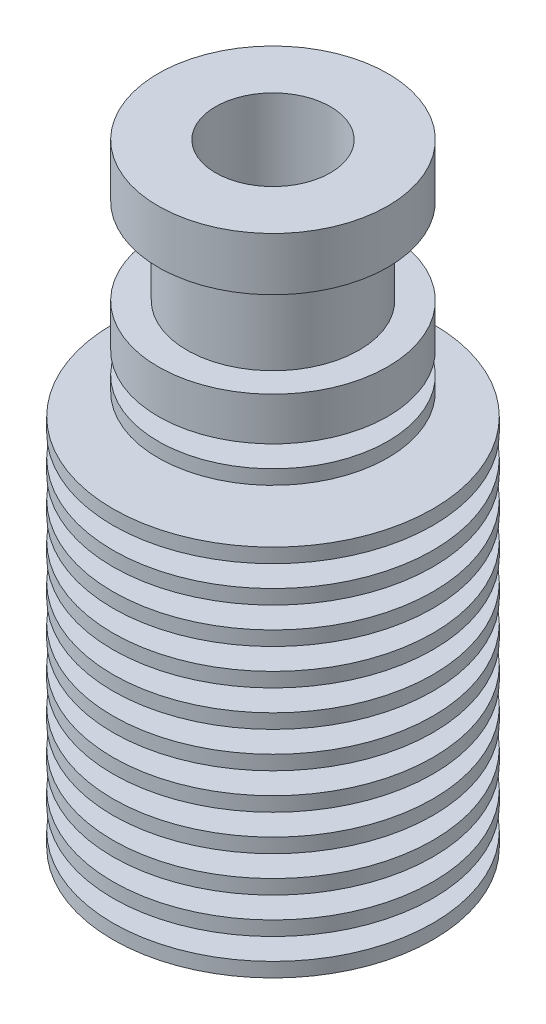
ISO-10303-21;
HEADER;
FILE_DESCRIPTION(('STEP AP214'),'2;1');
FILE_NAME('part.step','',(''),(''),'','','');
FILE_SCHEMA(('AUTOMOTIVE_DESIGN { 1 0 10303 214 1 1 1 1 }'));
ENDSEC;
DATA;
#1=APPLICATION_CONTEXT('core data for automotive mechanical design processes');
#2=APPLICATION_PROTOCOL_DEFINITION('international standard','automotive_design',2000,#1);
#3=PRODUCT_CONTEXT('',#1,'mechanical');
#4=PRODUCT('Part','Part','',(#3));
#5=PRODUCT_RELATED_PRODUCT_CATEGORY('part','',(#4));
#6=PRODUCT_DEFINITION_FORMATION('','',#4);
#7=PRODUCT_DEFINITION_CONTEXT('part definition',#1,'design');
#8=PRODUCT_DEFINITION('design','',#6,#7);
#9=PRODUCT_DEFINITION_SHAPE('','',#8);
#10=(LENGTH_UNIT() NAMED_UNIT(*) SI_UNIT(.MILLI.,.METRE.));
#11=(NAMED_UNIT(*) PLANE_ANGLE_UNIT() SI_UNIT($,.RADIAN.));
#12=(NAMED_UNIT(*) SI_UNIT($,.STERADIAN.) SOLID_ANGLE_UNIT());
#13=UNCERTAINTY_MEASURE_WITH_UNIT(LENGTH_MEASURE(1.E-05),#10,'distance_accuracy_value','');
#14=(GEOMETRIC_REPRESENTATION_CONTEXT(3) GLOBAL_UNCERTAINTY_ASSIGNED_CONTEXT((#13)) GLOBAL_UNIT_ASSIGNED_CONTEXT((#10,
#11,#12)) REPRESENTATION_CONTEXT('',''));
#15=CARTESIAN_POINT('',(0.,0.,0.));
#16=DIRECTION('',(0.,0.,1.));
#17=DIRECTION('',(1.,0.,0.));
#18=AXIS2_PLACEMENT_3D('',#15,#16,#17);
#19=CARTESIAN_POINT('',(0.,21.75,0.));
#20=DIRECTION('',(0.,1.,0.));
#21=DIRECTION('',(1.,0.,0.));
#22=AXIS2_PLACEMENT_3D('',#19,#20,#21);
#23=CYLINDRICAL_SURFACE('',#22,5.22115384615384);
#24=CARTESIAN_POINT('',(0.,21.,0.));
#25=DIRECTION('',(0.,-1.,0.));
#26=DIRECTION('',(1.,0.,0.));
#27=AXIS2_PLACEMENT_3D('',#24,#25,#26);
#28=CIRCLE('',#27,5.22115384615384);
#29=CARTESIAN_POINT('',(5.22115384615384,21.,0.));
#30=VERTEX_POINT('',#29);
#31=EDGE_CURVE('E27',#30,#30,#28,.T.);
#32=ORIENTED_EDGE('',*,*,#31,.F.);
#33=EDGE_LOOP('',(#32));
#34=FACE_BOUND('',#33,.T.);
#35=CARTESIAN_POINT('',(0.,22.5,0.));
#36=DIRECTION('',(0.,-1.,0.));
#37=DIRECTION('',(1.,0.,0.));
#38=AXIS2_PLACEMENT_3D('',#35,#36,#37);
#39=CIRCLE('',#38,5.22115384615384);
#40=CARTESIAN_POINT('',(5.22115384615384,22.5,0.));
#41=VERTEX_POINT('',#40);
#42=EDGE_CURVE('E11',#41,#41,#39,.T.);
#43=ORIENTED_EDGE('',*,*,#42,.T.);
#44=EDGE_LOOP('',(#43));
#45=FACE_BOUND('',#44,.T.);
#46=ADVANCED_FACE('F17',(#34,#45),#23,.T.);
#47=CARTESIAN_POINT('',(11.15,22.5,0.));
#48=DIRECTION('',(0.,1.,0.));
#49=DIRECTION('',(0.707106781186548,0.,0.707106781186548));
#50=AXIS2_PLACEMENT_3D('',#47,#48,#49);
#51=PLANE('',#50);
#52=ORIENTED_EDGE('',*,*,#42,.F.);
#53=EDGE_LOOP('',(#52));
#54=FACE_BOUND('',#53,.T.);
#55=CARTESIAN_POINT('',(0.,22.5,0.));
#56=DIRECTION('',(0.,1.,0.));
#57=DIRECTION('',(1.,0.,0.));
#58=AXIS2_PLACEMENT_3D('',#55,#56,#57);
#59=CIRCLE('',#58,11.15);
#60=CARTESIAN_POINT('',(11.15,22.5,0.));
#61=VERTEX_POINT('',#60);
#62=EDGE_CURVE('E214',#61,#61,#59,.T.);
#63=ORIENTED_EDGE('',*,*,#62,.F.);
#64=EDGE_LOOP('',(#63));
#65=FACE_BOUND('',#64,.T.);
#66=ADVANCED_FACE('F402',(#54,#65),#51,.F.);
#67=CARTESIAN_POINT('',(5.22115384615384,21.,0.));
#68=DIRECTION('',(0.,-1.,0.));
#69=DIRECTION('',(0.707106781186548,0.,0.707106781186548));
#70=AXIS2_PLACEMENT_3D('',#67,#68,#69);
#71=PLANE('',#70);
#72=CARTESIAN_POINT('',(0.,21.,0.));
#73=DIRECTION('',(0.,-1.,0.));
#74=DIRECTION('',(1.,0.,0.));
#75=AXIS2_PLACEMENT_3D('',#72,#73,#74);
#76=CIRCLE('',#75,11.15);
#77=CARTESIAN_POINT('',(11.15,21.,0.));
#78=VERTEX_POINT('',#77);
#79=EDGE_CURVE('E225',#78,#78,#76,.T.);
#80=ORIENTED_EDGE('',*,*,#79,.F.);
#81=EDGE_LOOP('',(#80));
#82=FACE_BOUND('',#81,.T.);
#83=ORIENTED_EDGE('',*,*,#31,.T.);
#84=EDGE_LOOP('',(#83));
#85=FACE_BOUND('',#84,.T.);
#86=ADVANCED_FACE('F407',(#82,#85),#71,.F.);
#87=CARTESIAN_POINT('',(0.,16.75,0.));
#88=DIRECTION('',(0.,1.,0.));
#89=DIRECTION('',(1.,0.,0.));
#90=AXIS2_PLACEMENT_3D('',#87,#88,#89);
#91=CYLINDRICAL_SURFACE('',#90,5.44230769230769);
#92=CARTESIAN_POINT('',(0.,16.,0.));
#93=DIRECTION('',(0.,-1.,0.));
#94=DIRECTION('',(1.,0.,0.));
#95=AXIS2_PLACEMENT_3D('',#92,#93,#94);
#96=CIRCLE('',#95,5.44230769230769);
#97=CARTESIAN_POINT('',(5.44230769230769,16.,0.));
#98=VERTEX_POINT('',#97);
#99=EDGE_CURVE('E230',#98,#98,#96,.T.);
#100=ORIENTED_EDGE('',*,*,#99,.F.);
#101=EDGE_LOOP('',(#100));
#102=FACE_BOUND('',#101,.T.);
#103=CARTESIAN_POINT('',(0.,17.5,0.));
#104=DIRECTION('',(0.,-1.,0.));
#105=DIRECTION('',(1.,0.,0.));
#106=AXIS2_PLACEMENT_3D('',#103,#104,#105);
#107=CIRCLE('',#106,5.44230769230769);
#108=CARTESIAN_POINT('',(5.44230769230769,17.5,0.));
#109=VERTEX_POINT('',#108);
#110=EDGE_CURVE('E233',#109,#109,#107,.T.);
#111=ORIENTED_EDGE('',*,*,#110,.T.);
#112=EDGE_LOOP('',(#111));
#113=FACE_BOUND('',#112,.T.);
#114=ADVANCED_FACE('F414',(#102,#113),#91,.T.);
#115=CARTESIAN_POINT('',(11.15,17.5,0.));
#116=DIRECTION('',(0.,1.,0.));
#117=DIRECTION('',(0.707106781186548,0.,0.707106781186548));
#118=AXIS2_PLACEMENT_3D('',#115,#116,#117);
#119=PLANE('',#118);
#120=ORIENTED_EDGE('',*,*,#110,.F.);
#121=EDGE_LOOP('',(#120));
#122=FACE_BOUND('',#121,.T.);
#123=CARTESIAN_POINT('',(0.,17.5,0.));
#124=DIRECTION('',(0.,1.,0.));
#125=DIRECTION('',(1.,0.,0.));
#126=AXIS2_PLACEMENT_3D('',#123,#124,#125);
#127=CIRCLE('',#126,11.15);
#128=CARTESIAN_POINT('',(11.15,17.5,0.));
#129=VERTEX_POINT('',#128);
#130=EDGE_CURVE('E237',#129,#129,#127,.T.);
#131=ORIENTED_EDGE('',*,*,#130,.F.);
#132=EDGE_LOOP('',(#131));
#133=FACE_BOUND('',#132,.T.);
#134=ADVANCED_FACE('F418',(#122,#133),#119,.F.);
#135=CARTESIAN_POINT('',(5.44230769230769,16.,0.));
#136=DIRECTION('',(0.,-1.,0.));
#137=DIRECTION('',(0.707106781186548,0.,0.707106781186548));
#138=AXIS2_PLACEMENT_3D('',#135,#136,#137);
#139=PLANE('',#138);
#140=CARTESIAN_POINT('',(0.,16.,0.));
#141=DIRECTION('',(0.,-1.,0.));
#142=DIRECTION('',(1.,0.,0.));
#143=AXIS2_PLACEMENT_3D('',#140,#141,#142);
#144=CIRCLE('',#143,11.15);
#145=CARTESIAN_POINT('',(11.15,16.,0.));
#146=VERTEX_POINT('',#145);
#147=EDGE_CURVE('E242',#146,#146,#144,.T.);
#148=ORIENTED_EDGE('',*,*,#147,.F.);
#149=EDGE_LOOP('',(#148));
#150=FACE_BOUND('',#149,.T.);
#151=ORIENTED_EDGE('',*,*,#99,.T.);
#152=EDGE_LOOP('',(#151));
#153=FACE_BOUND('',#152,.T.);
#154=ADVANCED_FACE('F422',(#150,#153),#139,.F.);
#155=CARTESIAN_POINT('',(0.,11.75,0.));
#156=DIRECTION('',(0.,1.,0.));
#157=DIRECTION('',(1.,0.,0.));
#158=AXIS2_PLACEMENT_3D('',#155,#156,#157);
#159=CYLINDRICAL_SURFACE('',#158,5.66346153846154);
#160=CARTESIAN_POINT('',(0.,11.,0.));
#161=DIRECTION('',(0.,-1.,0.));
#162=DIRECTION('',(1.,0.,0.));
#163=AXIS2_PLACEMENT_3D('',#160,#161,#162);
#164=CIRCLE('',#163,5.66346153846154);
#165=CARTESIAN_POINT('',(5.66346153846154,11.,0.));
#166=VERTEX_POINT('',#165);
#167=EDGE_CURVE('E247',#166,#166,#164,.T.);
#168=ORIENTED_EDGE('',*,*,#167,.F.);
#169=EDGE_LOOP('',(#168));
#170=FACE_BOUND('',#169,.T.);
#171=CARTESIAN_POINT('',(0.,12.5,0.));
#172=DIRECTION('',(0.,-1.,0.));
#173=DIRECTION('',(1.,0.,0.));
#174=AXIS2_PLACEMENT_3D('',#171,#172,#173);
#175=CIRCLE('',#174,5.66346153846154);
#176=CARTESIAN_POINT('',(5.66346153846154,12.5,0.));
#177=VERTEX_POINT('',#176);
#178=EDGE_CURVE('E234',#177,#177,#175,.T.);
#179=ORIENTED_EDGE('',*,*,#178,.T.);
#180=EDGE_LOOP('',(#179));
#181=FACE_BOUND('',#180,.T.);
#182=ADVANCED_FACE('F426',(#170,#181),#159,.T.);
#183=CARTESIAN_POINT('',(11.15,12.5,0.));
#184=DIRECTION('',(0.,1.,0.));
#185=DIRECTION('',(0.707106781186548,0.,0.707106781186548));
#186=AXIS2_PLACEMENT_3D('',#183,#184,#185);
#187=PLANE('',#186);
#188=ORIENTED_EDGE('',*,*,#178,.F.);
#189=EDGE_LOOP('',(#188));
#190=FACE_BOUND('',#189,.T.);
#191=CARTESIAN_POINT('',(0.,12.5,0.));
#192=DIRECTION('',(0.,1.,0.));
#193=DIRECTION('',(1.,0.,0.));
#194=AXIS2_PLACEMENT_3D('',#191,#192,#193);
#195=CIRCLE('',#194,11.15);
#196=CARTESIAN_POINT('',(11.15,12.5,0.));
#197=VERTEX_POINT('',#196);
#198=EDGE_CURVE('E253',#197,#197,#195,.T.);
#199=ORIENTED_EDGE('',*,*,#198,.F.);
#200=EDGE_LOOP('',(#199));
#201=FACE_BOUND('',#200,.T.);
#202=ADVANCED_FACE('F430',(#190,#201),#187,.F.);
#203=CARTESIAN_POINT('',(5.66346153846154,11.,0.));
#204=DIRECTION('',(0.,-1.,0.));
#205=DIRECTION('',(0.707106781186548,0.,0.707106781186548));
#206=AXIS2_PLACEMENT_3D('',#203,#204,#205);
#207=PLANE('',#206);
#208=CARTESIAN_POINT('',(0.,11.,0.));
#209=DIRECTION('',(0.,-1.,0.));
#210=DIRECTION('',(1.,0.,0.));
#211=AXIS2_PLACEMENT_3D('',#208,#209,#210);
#212=CIRCLE('',#211,11.15);
#213=CARTESIAN_POINT('',(11.15,11.,0.));
#214=VERTEX_POINT('',#213);
#215=EDGE_CURVE('E258',#214,#214,#212,.T.);
#216=ORIENTED_EDGE('',*,*,#215,.F.);
#217=EDGE_LOOP('',(#216));
#218=FACE_BOUND('',#217,.T.);
#219=ORIENTED_EDGE('',*,*,#167,.T.);
#220=EDGE_LOOP('',(#219));
#221=FACE_BOUND('',#220,.T.);
#222=ADVANCED_FACE('F434',(#218,#221),#207,.F.);
#223=CARTESIAN_POINT('',(5.88461538461538,6.,0.));
#224=DIRECTION('',(0.,-1.,0.));
#225=DIRECTION('',(0.707106781186548,0.,0.707106781186548));
#226=AXIS2_PLACEMENT_3D('',#223,#224,#225);
#227=PLANE('',#226);
#228=CARTESIAN_POINT('',(0.,6.,0.));
#229=DIRECTION('',(0.,-1.,0.));
#230=DIRECTION('',(1.,0.,0.));
#231=AXIS2_PLACEMENT_3D('',#228,#229,#230);
#232=CIRCLE('',#231,11.15);
#233=CARTESIAN_POINT('',(11.15,6.,0.));
#234=VERTEX_POINT('',#233);
#235=EDGE_CURVE('E262',#234,#234,#232,.T.);
#236=ORIENTED_EDGE('',*,*,#235,.F.);
#237=EDGE_LOOP('',(#236));
#238=FACE_BOUND('',#237,.T.);
#239=CARTESIAN_POINT('',(0.,6.,0.));
#240=DIRECTION('',(0.,-1.,0.));
#241=DIRECTION('',(1.,0.,0.));
#242=AXIS2_PLACEMENT_3D('',#239,#240,#241);
#243=CIRCLE('',#242,5.88461538461538);
#244=CARTESIAN_POINT('',(5.88461538461538,6.,0.));
#245=VERTEX_POINT('',#244);
#246=EDGE_CURVE('E250',#245,#245,#243,.T.);
#247=ORIENTED_EDGE('',*,*,#246,.T.);
#248=EDGE_LOOP('',(#247));
#249=FACE_BOUND('',#248,.T.);
#250=ADVANCED_FACE('F438',(#238,#249),#227,.F.);
#251=CARTESIAN_POINT('',(0.,6.75,0.));
#252=DIRECTION('',(0.,1.,0.));
#253=DIRECTION('',(1.,0.,0.));
#254=AXIS2_PLACEMENT_3D('',#251,#252,#253);
#255=CYLINDRICAL_SURFACE('',#254,5.88461538461538);
#256=ORIENTED_EDGE('',*,*,#246,.F.);
#257=EDGE_LOOP('',(#256));
#258=FACE_BOUND('',#257,.T.);
#259=CARTESIAN_POINT('',(0.,7.5,0.));
#260=DIRECTION('',(0.,-1.,0.));
#261=DIRECTION('',(1.,0.,0.));
#262=AXIS2_PLACEMENT_3D('',#259,#260,#261);
#263=CIRCLE('',#262,5.88461538461538);
#264=CARTESIAN_POINT('',(5.88461538461538,7.5,0.));
#265=VERTEX_POINT('',#264);
#266=EDGE_CURVE('E269',#265,#265,#263,.T.);
#267=ORIENTED_EDGE('',*,*,#266,.T.);
#268=EDGE_LOOP('',(#267));
#269=FACE_BOUND('',#268,.T.);
#270=ADVANCED_FACE('F442',(#258,#269),#255,.T.);
#271=CARTESIAN_POINT('',(11.15,7.5,0.));
#272=DIRECTION('',(0.,1.,0.));
#273=DIRECTION('',(0.707106781186548,0.,0.707106781186548));
#274=AXIS2_PLACEMENT_3D('',#271,#272,#273);
#275=PLANE('',#274);
#276=ORIENTED_EDGE('',*,*,#266,.F.);
#277=EDGE_LOOP('',(#276));
#278=FACE_BOUND('',#277,.T.);
#279=CARTESIAN_POINT('',(0.,7.5,0.));
#280=DIRECTION('',(0.,1.,0.));
#281=DIRECTION('',(1.,0.,0.));
#282=AXIS2_PLACEMENT_3D('',#279,#280,#281);
#283=CIRCLE('',#282,11.15);
#284=CARTESIAN_POINT('',(11.15,7.5,0.));
#285=VERTEX_POINT('',#284);
#286=EDGE_CURVE('E273',#285,#285,#283,.T.);
#287=ORIENTED_EDGE('',*,*,#286,.F.);
#288=EDGE_LOOP('',(#287));
#289=FACE_BOUND('',#288,.T.);
#290=ADVANCED_FACE('F446',(#278,#289),#275,.F.);
#291=CARTESIAN_POINT('',(6.10576923076923,1.,0.));
#292=DIRECTION('',(0.,-1.,0.));
#293=DIRECTION('',(0.707106781186548,0.,0.707106781186548));
#294=AXIS2_PLACEMENT_3D('',#291,#292,#293);
#295=PLANE('',#294);
#296=CARTESIAN_POINT('',(0.,1.,0.));
#297=DIRECTION('',(0.,-1.,0.));
#298=DIRECTION('',(1.,0.,0.));
#299=AXIS2_PLACEMENT_3D('',#296,#297,#298);
#300=CIRCLE('',#299,11.15);
#301=CARTESIAN_POINT('',(11.15,1.,0.));
#302=VERTEX_POINT('',#301);
#303=EDGE_CURVE('E256',#302,#302,#300,.T.);
#304=ORIENTED_EDGE('',*,*,#303,.F.);
#305=EDGE_LOOP('',(#304));
#306=FACE_BOUND('',#305,.T.);
#307=CARTESIAN_POINT('',(0.,1.,0.));
#308=DIRECTION('',(0.,-1.,0.));
#309=DIRECTION('',(1.,0.,0.));
#310=AXIS2_PLACEMENT_3D('',#307,#308,#309);
#311=CIRCLE('',#310,6.10576923076923);
#312=CARTESIAN_POINT('',(6.10576923076923,1.,0.));
#313=VERTEX_POINT('',#312);
#314=EDGE_CURVE('E272',#313,#313,#311,.T.);
#315=ORIENTED_EDGE('',*,*,#314,.T.);
#316=EDGE_LOOP('',(#315));
#317=FACE_BOUND('',#316,.T.);
#318=ADVANCED_FACE('F450',(#306,#317),#295,.F.);
#319=CARTESIAN_POINT('',(0.,1.75,0.));
#320=DIRECTION('',(0.,1.,0.));
#321=DIRECTION('',(1.,0.,0.));
#322=AXIS2_PLACEMENT_3D('',#319,#320,#321);
#323=CYLINDRICAL_SURFACE('',#322,6.10576923076923);
#324=ORIENTED_EDGE('',*,*,#314,.F.);
#325=EDGE_LOOP('',(#324));
#326=FACE_BOUND('',#325,.T.);
#327=CARTESIAN_POINT('',(0.,2.5,0.));
#328=DIRECTION('',(0.,-1.,0.));
#329=DIRECTION('',(1.,0.,0.));
#330=AXIS2_PLACEMENT_3D('',#327,#328,#329);
#331=CIRCLE('',#330,6.10576923076923);
#332=CARTESIAN_POINT('',(6.10576923076923,2.5,0.));
#333=VERTEX_POINT('',#332);
#334=EDGE_CURVE('E281',#333,#333,#331,.T.);
#335=ORIENTED_EDGE('',*,*,#334,.T.);
#336=EDGE_LOOP('',(#335));
#337=FACE_BOUND('',#336,.T.);
#338=ADVANCED_FACE('F454',(#326,#337),#323,.T.);
#339=CARTESIAN_POINT('',(11.15,2.5,0.));
#340=DIRECTION('',(0.,1.,0.));
#341=DIRECTION('',(0.707106781186548,0.,0.707106781186548));
#342=AXIS2_PLACEMENT_3D('',#339,#340,#341);
#343=PLANE('',#342);
#344=ORIENTED_EDGE('',*,*,#334,.F.);
#345=EDGE_LOOP('',(#344));
#346=FACE_BOUND('',#345,.T.);
#347=CARTESIAN_POINT('',(0.,2.5,0.));
#348=DIRECTION('',(0.,1.,0.));
#349=DIRECTION('',(1.,0.,0.));
#350=AXIS2_PLACEMENT_3D('',#347,#348,#349);
#351=CIRCLE('',#350,11.15);
#352=CARTESIAN_POINT('',(11.15,2.5,0.));
#353=VERTEX_POINT('',#352);
#354=EDGE_CURVE('E265',#353,#353,#351,.T.);
#355=ORIENTED_EDGE('',*,*,#354,.F.);
#356=EDGE_LOOP('',(#355));
#357=FACE_BOUND('',#356,.T.);
#358=ADVANCED_FACE('F458',(#346,#357),#343,.F.);
#359=CARTESIAN_POINT('',(0.,4.25,0.));
#360=DIRECTION('',(0.,1.,0.));
#361=DIRECTION('',(1.,0.,0.));
#362=AXIS2_PLACEMENT_3D('',#359,#360,#361);
#363=CYLINDRICAL_SURFACE('',#362,5.9951923076923);
#364=CARTESIAN_POINT('',(0.,3.5,0.));
#365=DIRECTION('',(0.,-1.,0.));
#366=DIRECTION('',(1.,0.,0.));
#367=AXIS2_PLACEMENT_3D('',#364,#365,#366);
#368=CIRCLE('',#367,5.99519230769231);
#369=CARTESIAN_POINT('',(5.99519230769231,3.5,0.));
#370=VERTEX_POINT('',#369);
#371=EDGE_CURVE('E287',#370,#370,#368,.T.);
#372=ORIENTED_EDGE('',*,*,#371,.F.);
#373=EDGE_LOOP('',(#372));
#374=FACE_BOUND('',#373,.T.);
#375=CARTESIAN_POINT('',(0.,5.,0.));
#376=DIRECTION('',(0.,-1.,0.));
#377=DIRECTION('',(1.,0.,0.));
#378=AXIS2_PLACEMENT_3D('',#375,#376,#377);
#379=CIRCLE('',#378,5.9951923076923);
#380=CARTESIAN_POINT('',(5.9951923076923,5.,0.));
#381=VERTEX_POINT('',#380);
#382=EDGE_CURVE('E284',#381,#381,#379,.T.);
#383=ORIENTED_EDGE('',*,*,#382,.T.);
#384=EDGE_LOOP('',(#383));
#385=FACE_BOUND('',#384,.T.);
#386=ADVANCED_FACE('F462',(#374,#385),#363,.T.);
#387=CARTESIAN_POINT('',(11.15,5.,0.));
#388=DIRECTION('',(0.,1.,0.));
#389=DIRECTION('',(0.707106781186548,0.,0.707106781186548));
#390=AXIS2_PLACEMENT_3D('',#387,#388,#389);
#391=PLANE('',#390);
#392=ORIENTED_EDGE('',*,*,#382,.F.);
#393=EDGE_LOOP('',(#392));
#394=FACE_BOUND('',#393,.T.);
#395=CARTESIAN_POINT('',(0.,5.,0.));
#396=DIRECTION('',(0.,1.,0.));
#397=DIRECTION('',(1.,0.,0.));
#398=AXIS2_PLACEMENT_3D('',#395,#396,#397);
#399=CIRCLE('',#398,11.15);
#400=CARTESIAN_POINT('',(11.15,5.,0.));
#401=VERTEX_POINT('',#400);
#402=EDGE_CURVE('E266',#401,#401,#399,.T.);
#403=ORIENTED_EDGE('',*,*,#402,.F.);
#404=EDGE_LOOP('',(#403));
#405=FACE_BOUND('',#404,.T.);
#406=ADVANCED_FACE('F466',(#394,#405),#391,.F.);
#407=CARTESIAN_POINT('',(5.99519230769231,3.5,0.));
#408=DIRECTION('',(0.,-1.,0.));
#409=DIRECTION('',(0.707106781186548,0.,0.707106781186548));
#410=AXIS2_PLACEMENT_3D('',#407,#408,#409);
#411=PLANE('',#410);
#412=CARTESIAN_POINT('',(0.,3.5,0.));
#413=DIRECTION('',(0.,-1.,0.));
#414=DIRECTION('',(1.,0.,0.));
#415=AXIS2_PLACEMENT_3D('',#412,#413,#414);
#416=CIRCLE('',#415,11.15);
#417=CARTESIAN_POINT('',(11.15,3.5,0.));
#418=VERTEX_POINT('',#417);
#419=EDGE_CURVE('E261',#418,#418,#416,.T.);
#420=ORIENTED_EDGE('',*,*,#419,.F.);
#421=EDGE_LOOP('',(#420));
#422=FACE_BOUND('',#421,.T.);
#423=ORIENTED_EDGE('',*,*,#371,.T.);
#424=EDGE_LOOP('',(#423));
#425=FACE_BOUND('',#424,.T.);
#426=ADVANCED_FACE('F470',(#422,#425),#411,.F.);
#427=CARTESIAN_POINT('',(5.77403846153846,8.5,0.));
#428=DIRECTION('',(0.,-1.,0.));
#429=DIRECTION('',(0.707106781186548,0.,0.707106781186548));
#430=AXIS2_PLACEMENT_3D('',#427,#428,#429);
#431=PLANE('',#430);
#432=CARTESIAN_POINT('',(0.,8.5,0.));
#433=DIRECTION('',(0.,-1.,0.));
#434=DIRECTION('',(1.,0.,0.));
#435=AXIS2_PLACEMENT_3D('',#432,#433,#434);
#436=CIRCLE('',#435,11.15);
#437=CARTESIAN_POINT('',(11.15,8.5,0.));
#438=VERTEX_POINT('',#437);
#439=EDGE_CURVE('E276',#438,#438,#436,.T.);
#440=ORIENTED_EDGE('',*,*,#439,.F.);
#441=EDGE_LOOP('',(#440));
#442=FACE_BOUND('',#441,.T.);
#443=CARTESIAN_POINT('',(0.,8.5,0.));
#444=DIRECTION('',(0.,-1.,0.));
#445=DIRECTION('',(1.,0.,0.));
#446=AXIS2_PLACEMENT_3D('',#443,#444,#445);
#447=CIRCLE('',#446,5.77403846153846);
#448=CARTESIAN_POINT('',(5.77403846153846,8.5,0.));
#449=VERTEX_POINT('',#448);
#450=EDGE_CURVE('E290',#449,#449,#447,.T.);
#451=ORIENTED_EDGE('',*,*,#450,.T.);
#452=EDGE_LOOP('',(#451));
#453=FACE_BOUND('',#452,.T.);
#454=ADVANCED_FACE('F474',(#442,#453),#431,.F.);
#455=CARTESIAN_POINT('',(0.,9.25,0.));
#456=DIRECTION('',(0.,1.,0.));
#457=DIRECTION('',(1.,0.,0.));
#458=AXIS2_PLACEMENT_3D('',#455,#456,#457);
#459=CYLINDRICAL_SURFACE('',#458,5.77403846153846);
#460=ORIENTED_EDGE('',*,*,#450,.F.);
#461=EDGE_LOOP('',(#460));
#462=FACE_BOUND('',#461,.T.);
#463=CARTESIAN_POINT('',(0.,10.,0.));
#464=DIRECTION('',(0.,-1.,0.));
#465=DIRECTION('',(1.,0.,0.));
#466=AXIS2_PLACEMENT_3D('',#463,#464,#465);
#467=CIRCLE('',#466,5.77403846153846);
#468=CARTESIAN_POINT('',(5.77403846153846,10.,0.));
#469=VERTEX_POINT('',#468);
#470=EDGE_CURVE('E301',#469,#469,#467,.T.);
#471=ORIENTED_EDGE('',*,*,#470,.T.);
#472=EDGE_LOOP('',(#471));
#473=FACE_BOUND('',#472,.T.);
#474=ADVANCED_FACE('F478',(#462,#473),#459,.T.);
#475=CARTESIAN_POINT('',(11.15,10.,0.));
#476=DIRECTION('',(0.,1.,0.));
#477=DIRECTION('',(0.707106781186548,0.,0.707106781186548));
#478=AXIS2_PLACEMENT_3D('',#475,#476,#477);
#479=PLANE('',#478);
#480=ORIENTED_EDGE('',*,*,#470,.F.);
#481=EDGE_LOOP('',(#480));
#482=FACE_BOUND('',#481,.T.);
#483=CARTESIAN_POINT('',(0.,10.,0.));
#484=DIRECTION('',(0.,1.,0.));
#485=DIRECTION('',(1.,0.,0.));
#486=AXIS2_PLACEMENT_3D('',#483,#484,#485);
#487=CIRCLE('',#486,11.15);
#488=CARTESIAN_POINT('',(11.15,10.,0.));
#489=VERTEX_POINT('',#488);
#490=EDGE_CURVE('E246',#489,#489,#487,.T.);
#491=ORIENTED_EDGE('',*,*,#490,.F.);
#492=EDGE_LOOP('',(#491));
#493=FACE_BOUND('',#492,.T.);
#494=ADVANCED_FACE('F482',(#482,#493),#479,.F.);
#495=CARTESIAN_POINT('',(5.55288461538461,13.5,0.));
#496=DIRECTION('',(0.,-1.,0.));
#497=DIRECTION('',(0.707106781186548,0.,0.707106781186548));
#498=AXIS2_PLACEMENT_3D('',#495,#496,#497);
#499=PLANE('',#498);
#500=CARTESIAN_POINT('',(0.,13.5,0.));
#501=DIRECTION('',(0.,-1.,0.));
#502=DIRECTION('',(1.,0.,0.));
#503=AXIS2_PLACEMENT_3D('',#500,#501,#502);
#504=CIRCLE('',#503,11.15);
#505=CARTESIAN_POINT('',(11.15,13.5,0.));
#506=VERTEX_POINT('',#505);
#507=EDGE_CURVE('E257',#506,#506,#504,.T.);
#508=ORIENTED_EDGE('',*,*,#507,.F.);
#509=EDGE_LOOP('',(#508));
#510=FACE_BOUND('',#509,.T.);
#511=CARTESIAN_POINT('',(0.,13.5,0.));
#512=DIRECTION('',(0.,-1.,0.));
#513=DIRECTION('',(1.,0.,0.));
#514=AXIS2_PLACEMENT_3D('',#511,#512,#513);
#515=CIRCLE('',#514,5.55288461538461);
#516=CARTESIAN_POINT('',(5.55288461538461,13.5,0.));
#517=VERTEX_POINT('',#516);
#518=EDGE_CURVE('E304',#517,#517,#515,.T.);
#519=ORIENTED_EDGE('',*,*,#518,.T.);
#520=EDGE_LOOP('',(#519));
#521=FACE_BOUND('',#520,.T.);
#522=ADVANCED_FACE('F486',(#510,#521),#499,.F.);
#523=CARTESIAN_POINT('',(0.,14.25,0.));
#524=DIRECTION('',(0.,1.,0.));
#525=DIRECTION('',(1.,0.,0.));
#526=AXIS2_PLACEMENT_3D('',#523,#524,#525);
#527=CYLINDRICAL_SURFACE('',#526,5.55288461538461);
#528=ORIENTED_EDGE('',*,*,#518,.F.);
#529=EDGE_LOOP('',(#528));
#530=FACE_BOUND('',#529,.T.);
#531=CARTESIAN_POINT('',(0.,15.,0.));
#532=DIRECTION('',(0.,-1.,0.));
#533=DIRECTION('',(1.,0.,0.));
#534=AXIS2_PLACEMENT_3D('',#531,#532,#533);
#535=CIRCLE('',#534,5.55288461538461);
#536=CARTESIAN_POINT('',(5.55288461538461,15.,0.));
#537=VERTEX_POINT('',#536);
#538=EDGE_CURVE('E311',#537,#537,#535,.T.);
#539=ORIENTED_EDGE('',*,*,#538,.T.);
#540=EDGE_LOOP('',(#539));
#541=FACE_BOUND('',#540,.T.);
#542=ADVANCED_FACE('F490',(#530,#541),#527,.T.);
#543=CARTESIAN_POINT('',(11.15,15.,0.));
#544=DIRECTION('',(0.,1.,0.));
#545=DIRECTION('',(0.707106781186548,0.,0.707106781186548));
#546=AXIS2_PLACEMENT_3D('',#543,#544,#545);
#547=PLANE('',#546);
#548=ORIENTED_EDGE('',*,*,#538,.F.);
#549=EDGE_LOOP('',(#548));
#550=FACE_BOUND('',#549,.T.);
#551=CARTESIAN_POINT('',(0.,15.,0.));
#552=DIRECTION('',(0.,1.,0.));
#553=DIRECTION('',(1.,0.,0.));
#554=AXIS2_PLACEMENT_3D('',#551,#552,#553);
#555=CIRCLE('',#554,11.15);
#556=CARTESIAN_POINT('',(11.15,15.,0.));
#557=VERTEX_POINT('',#556);
#558=EDGE_CURVE('E245',#557,#557,#555,.T.);
#559=ORIENTED_EDGE('',*,*,#558,.F.);
#560=EDGE_LOOP('',(#559));
#561=FACE_BOUND('',#560,.T.);
#562=ADVANCED_FACE('F494',(#550,#561),#547,.F.);
#563=CARTESIAN_POINT('',(5.33173076923077,18.5,0.));
#564=DIRECTION('',(0.,-1.,0.));
#565=DIRECTION('',(0.707106781186548,0.,0.707106781186548));
#566=AXIS2_PLACEMENT_3D('',#563,#564,#565);
#567=PLANE('',#566);
#568=CARTESIAN_POINT('',(0.,18.5,0.));
#569=DIRECTION('',(0.,-1.,0.));
#570=DIRECTION('',(1.,0.,0.));
#571=AXIS2_PLACEMENT_3D('',#568,#569,#570);
#572=CIRCLE('',#571,11.15);
#573=CARTESIAN_POINT('',(11.15,18.5,0.));
#574=VERTEX_POINT('',#573);
#575=EDGE_CURVE('E240',#574,#574,#572,.T.);
#576=ORIENTED_EDGE('',*,*,#575,.F.);
#577=EDGE_LOOP('',(#576));
#578=FACE_BOUND('',#577,.T.);
#579=CARTESIAN_POINT('',(0.,18.5,0.));
#580=DIRECTION('',(0.,-1.,0.));
#581=DIRECTION('',(1.,0.,0.));
#582=AXIS2_PLACEMENT_3D('',#579,#580,#581);
#583=CIRCLE('',#582,5.33173076923077);
#584=CARTESIAN_POINT('',(5.33173076923077,18.5,0.));
#585=VERTEX_POINT('',#584);
#586=EDGE_CURVE('E314',#585,#585,#583,.T.);
#587=ORIENTED_EDGE('',*,*,#586,.T.);
#588=EDGE_LOOP('',(#587));
#589=FACE_BOUND('',#588,.T.);
#590=ADVANCED_FACE('F498',(#578,#589),#567,.F.);
#591=CARTESIAN_POINT('',(0.,19.25,0.));
#592=DIRECTION('',(0.,1.,0.));
#593=DIRECTION('',(1.,0.,0.));
#594=AXIS2_PLACEMENT_3D('',#591,#592,#593);
#595=CYLINDRICAL_SURFACE('',#594,5.33173076923077);
#596=ORIENTED_EDGE('',*,*,#586,.F.);
#597=EDGE_LOOP('',(#596));
#598=FACE_BOUND('',#597,.T.);
#599=CARTESIAN_POINT('',(0.,20.,0.));
#600=DIRECTION('',(0.,-1.,0.));
#601=DIRECTION('',(1.,0.,0.));
#602=AXIS2_PLACEMENT_3D('',#599,#600,#601);
#603=CIRCLE('',#602,5.33173076923077);
#604=CARTESIAN_POINT('',(5.33173076923077,20.,0.));
#605=VERTEX_POINT('',#604);
#606=EDGE_CURVE('E321',#605,#605,#603,.T.);
#607=ORIENTED_EDGE('',*,*,#606,.T.);
#608=EDGE_LOOP('',(#607));
#609=FACE_BOUND('',#608,.T.);
#610=ADVANCED_FACE('F502',(#598,#609),#595,.T.);
#611=CARTESIAN_POINT('',(11.15,20.,0.));
#612=DIRECTION('',(0.,1.,0.));
#613=DIRECTION('',(0.707106781186548,0.,0.707106781186548));
#614=AXIS2_PLACEMENT_3D('',#611,#612,#613);
#615=PLANE('',#614);
#616=ORIENTED_EDGE('',*,*,#606,.F.);
#617=EDGE_LOOP('',(#616));
#618=FACE_BOUND('',#617,.T.);
#619=CARTESIAN_POINT('',(0.,20.,0.));
#620=DIRECTION('',(0.,1.,0.));
#621=DIRECTION('',(1.,0.,0.));
#622=AXIS2_PLACEMENT_3D('',#619,#620,#621);
#623=CIRCLE('',#622,11.15);
#624=CARTESIAN_POINT('',(11.15,20.,0.));
#625=VERTEX_POINT('',#624);
#626=EDGE_CURVE('E229',#625,#625,#623,.T.);
#627=ORIENTED_EDGE('',*,*,#626,.F.);
#628=EDGE_LOOP('',(#627));
#629=FACE_BOUND('',#628,.T.);
#630=ADVANCED_FACE('F506',(#618,#629),#615,.F.);
#631=CARTESIAN_POINT('',(5.11057692307692,23.5,0.));
#632=DIRECTION('',(0.,-1.,0.));
#633=DIRECTION('',(0.707106781186548,0.,0.707106781186548));
#634=AXIS2_PLACEMENT_3D('',#631,#632,#633);
#635=PLANE('',#634);
#636=CARTESIAN_POINT('',(0.,23.5,0.));
#637=DIRECTION('',(0.,-1.,0.));
#638=DIRECTION('',(1.,0.,0.));
#639=AXIS2_PLACEMENT_3D('',#636,#637,#638);
#640=CIRCLE('',#639,11.15);
#641=CARTESIAN_POINT('',(11.15,23.5,0.));
#642=VERTEX_POINT('',#641);
#643=EDGE_CURVE('E217',#642,#642,#640,.T.);
#644=ORIENTED_EDGE('',*,*,#643,.F.);
#645=EDGE_LOOP('',(#644));
#646=FACE_BOUND('',#645,.T.);
#647=CARTESIAN_POINT('',(0.,23.5,0.));
#648=DIRECTION('',(0.,-1.,0.));
#649=DIRECTION('',(1.,0.,0.));
#650=AXIS2_PLACEMENT_3D('',#647,#648,#649);
#651=CIRCLE('',#650,5.11057692307692);
#652=CARTESIAN_POINT('',(5.11057692307692,23.5,0.));
#653=VERTEX_POINT('',#652);
#654=EDGE_CURVE('E324',#653,#653,#651,.T.);
#655=ORIENTED_EDGE('',*,*,#654,.T.);
#656=EDGE_LOOP('',(#655));
#657=FACE_BOUND('',#656,.T.);
#658=ADVANCED_FACE('F510',(#646,#657),#635,.F.);
#659=CARTESIAN_POINT('',(0.,24.25,0.));
#660=DIRECTION('',(0.,1.,0.));
#661=DIRECTION('',(1.,0.,0.));
#662=AXIS2_PLACEMENT_3D('',#659,#660,#661);
#663=CYLINDRICAL_SURFACE('',#662,5.11057692307692);
#664=ORIENTED_EDGE('',*,*,#654,.F.);
#665=EDGE_LOOP('',(#664));
#666=FACE_BOUND('',#665,.T.);
#667=CARTESIAN_POINT('',(0.,25.,0.));
#668=DIRECTION('',(0.,-1.,0.));
#669=DIRECTION('',(1.,0.,0.));
#670=AXIS2_PLACEMENT_3D('',#667,#668,#669);
#671=CIRCLE('',#670,5.11057692307692);
#672=CARTESIAN_POINT('',(5.11057692307692,25.,0.));
#673=VERTEX_POINT('',#672);
#674=EDGE_CURVE('E329',#673,#673,#671,.T.);
#675=ORIENTED_EDGE('',*,*,#674,.T.);
#676=EDGE_LOOP('',(#675));
#677=FACE_BOUND('',#676,.T.);
#678=ADVANCED_FACE('F514',(#666,#677),#663,.T.);
#679=CARTESIAN_POINT('',(11.15,25.,0.));
#680=DIRECTION('',(0.,1.,0.));
#681=DIRECTION('',(0.707106781186548,0.,0.707106781186548));
#682=AXIS2_PLACEMENT_3D('',#679,#680,#681);
#683=PLANE('',#682);
#684=ORIENTED_EDGE('',*,*,#674,.F.);
#685=EDGE_LOOP('',(#684));
#686=FACE_BOUND('',#685,.T.);
#687=CARTESIAN_POINT('',(0.,25.,0.));
#688=DIRECTION('',(0.,1.,0.));
#689=DIRECTION('',(1.,0.,0.));
#690=AXIS2_PLACEMENT_3D('',#687,#688,#689);
#691=CIRCLE('',#690,11.15);
#692=CARTESIAN_POINT('',(11.15,25.,0.));
#693=VERTEX_POINT('',#692);
#694=EDGE_CURVE('E228',#693,#693,#691,.T.);
#695=ORIENTED_EDGE('',*,*,#694,.F.);
#696=EDGE_LOOP('',(#695));
#697=FACE_BOUND('',#696,.T.);
#698=ADVANCED_FACE('F518',(#686,#697),#683,.F.);
#699=CARTESIAN_POINT('',(0.,13.,0.));
#700=DIRECTION('',(0.,-1.,0.));
#701=DIRECTION('',(1.,0.,0.));
#702=AXIS2_PLACEMENT_3D('',#699,#700,#701);
#703=CYLINDRICAL_SURFACE('',#702,11.15);
#704=CARTESIAN_POINT('',(0.,26.,0.));
#705=DIRECTION('',(0.,-1.,0.));
#706=DIRECTION('',(1.,0.,0.));
#707=AXIS2_PLACEMENT_3D('',#704,#705,#706);
#708=CIRCLE('',#707,11.15);
#709=CARTESIAN_POINT('',(11.15,26.,0.));
#710=VERTEX_POINT('',#709);
#711=EDGE_CURVE('E332',#710,#710,#708,.T.);
#712=ORIENTED_EDGE('',*,*,#711,.T.);
#713=EDGE_LOOP('',(#712));
#714=FACE_BOUND('',#713,.T.);
#715=ORIENTED_EDGE('',*,*,#694,.T.);
#716=EDGE_LOOP('',(#715));
#717=FACE_BOUND('',#716,.T.);
#718=ADVANCED_FACE('F522',(#714,#717),#703,.T.);
#719=CARTESIAN_POINT('',(0.,13.,0.));
#720=DIRECTION('',(0.,-1.,0.));
#721=DIRECTION('',(1.,0.,0.));
#722=AXIS2_PLACEMENT_3D('',#719,#720,#721);
#723=CYLINDRICAL_SURFACE('',#722,11.15);
#724=ORIENTED_EDGE('',*,*,#79,.T.);
#725=EDGE_LOOP('',(#724));
#726=FACE_BOUND('',#725,.T.);
#727=ORIENTED_EDGE('',*,*,#626,.T.);
#728=EDGE_LOOP('',(#727));
#729=FACE_BOUND('',#728,.T.);
#730=ADVANCED_FACE('F526',(#726,#729),#723,.T.);
#731=CARTESIAN_POINT('',(0.,13.,0.));
#732=DIRECTION('',(0.,-1.,0.));
#733=DIRECTION('',(1.,0.,0.));
#734=AXIS2_PLACEMENT_3D('',#731,#732,#733);
#735=CYLINDRICAL_SURFACE('',#734,11.15);
#736=ORIENTED_EDGE('',*,*,#558,.T.);
#737=EDGE_LOOP('',(#736));
#738=FACE_BOUND('',#737,.T.);
#739=ORIENTED_EDGE('',*,*,#147,.T.);
#740=EDGE_LOOP('',(#739));
#741=FACE_BOUND('',#740,.T.);
#742=ADVANCED_FACE('F530',(#738,#741),#735,.T.);
#743=CARTESIAN_POINT('',(0.,13.,0.));
#744=DIRECTION('',(0.,-1.,0.));
#745=DIRECTION('',(1.,0.,0.));
#746=AXIS2_PLACEMENT_3D('',#743,#744,#745);
#747=CYLINDRICAL_SURFACE('',#746,11.15);
#748=ORIENTED_EDGE('',*,*,#490,.T.);
#749=EDGE_LOOP('',(#748));
#750=FACE_BOUND('',#749,.T.);
#751=ORIENTED_EDGE('',*,*,#215,.T.);
#752=EDGE_LOOP('',(#751));
#753=FACE_BOUND('',#752,.T.);
#754=ADVANCED_FACE('F534',(#750,#753),#747,.T.);
#755=CARTESIAN_POINT('',(0.,13.,0.));
#756=DIRECTION('',(0.,-1.,0.));
#757=DIRECTION('',(1.,0.,0.));
#758=AXIS2_PLACEMENT_3D('',#755,#756,#757);
#759=CYLINDRICAL_SURFACE('',#758,11.15);
#760=ORIENTED_EDGE('',*,*,#419,.T.);
#761=EDGE_LOOP('',(#760));
#762=FACE_BOUND('',#761,.T.);
#763=ORIENTED_EDGE('',*,*,#354,.T.);
#764=EDGE_LOOP('',(#763));
#765=FACE_BOUND('',#764,.T.);
#766=ADVANCED_FACE('F538',(#762,#765),#759,.T.);
#767=CARTESIAN_POINT('',(0.,13.,0.));
#768=DIRECTION('',(0.,-1.,0.));
#769=DIRECTION('',(1.,0.,0.));
#770=AXIS2_PLACEMENT_3D('',#767,#768,#769);
#771=CYLINDRICAL_SURFACE('',#770,11.15);
#772=ORIENTED_EDGE('',*,*,#235,.T.);
#773=EDGE_LOOP('',(#772));
#774=FACE_BOUND('',#773,.T.);
#775=ORIENTED_EDGE('',*,*,#402,.T.);
#776=EDGE_LOOP('',(#775));
#777=FACE_BOUND('',#776,.T.);
#778=ADVANCED_FACE('F542',(#774,#777),#771,.T.);
#779=CARTESIAN_POINT('',(0.,13.,0.));
#780=DIRECTION('',(0.,-1.,0.));
#781=DIRECTION('',(1.,0.,0.));
#782=AXIS2_PLACEMENT_3D('',#779,#780,#781);
#783=CYLINDRICAL_SURFACE('',#782,11.15);
#784=ORIENTED_EDGE('',*,*,#286,.T.);
#785=EDGE_LOOP('',(#784));
#786=FACE_BOUND('',#785,.T.);
#787=ORIENTED_EDGE('',*,*,#439,.T.);
#788=EDGE_LOOP('',(#787));
#789=FACE_BOUND('',#788,.T.);
#790=ADVANCED_FACE('F546',(#786,#789),#783,.T.);
#791=CARTESIAN_POINT('',(0.,13.,0.));
#792=DIRECTION('',(0.,-1.,0.));
#793=DIRECTION('',(1.,0.,0.));
#794=AXIS2_PLACEMENT_3D('',#791,#792,#793);
#795=CYLINDRICAL_SURFACE('',#794,11.15);
#796=CARTESIAN_POINT('',(0.,0.,0.));
#797=DIRECTION('',(0.,-1.,0.));
#798=DIRECTION('',(1.,0.,0.));
#799=AXIS2_PLACEMENT_3D('',#796,#797,#798);
#800=CIRCLE('',#799,11.15);
#801=CARTESIAN_POINT('',(11.15,0.,0.));
#802=VERTEX_POINT('',#801);
#803=EDGE_CURVE('E337',#802,#802,#800,.T.);
#804=ORIENTED_EDGE('',*,*,#803,.F.);
#805=EDGE_LOOP('',(#804));
#806=FACE_BOUND('',#805,.T.);
#807=ORIENTED_EDGE('',*,*,#303,.T.);
#808=EDGE_LOOP('',(#807));
#809=FACE_BOUND('',#808,.T.);
#810=ADVANCED_FACE('F550',(#806,#809),#795,.T.);
#811=CARTESIAN_POINT('',(0.,13.,0.));
#812=DIRECTION('',(0.,-1.,0.));
#813=DIRECTION('',(1.,0.,0.));
#814=AXIS2_PLACEMENT_3D('',#811,#812,#813);
#815=CYLINDRICAL_SURFACE('',#814,11.15);
#816=ORIENTED_EDGE('',*,*,#198,.T.);
#817=EDGE_LOOP('',(#816));
#818=FACE_BOUND('',#817,.T.);
#819=ORIENTED_EDGE('',*,*,#507,.T.);
#820=EDGE_LOOP('',(#819));
#821=FACE_BOUND('',#820,.T.);
#822=ADVANCED_FACE('F554',(#818,#821),#815,.T.);
#823=CARTESIAN_POINT('',(0.,13.,0.));
#824=DIRECTION('',(0.,-1.,0.));
#825=DIRECTION('',(1.,0.,0.));
#826=AXIS2_PLACEMENT_3D('',#823,#824,#825);
#827=CYLINDRICAL_SURFACE('',#826,11.15);
#828=ORIENTED_EDGE('',*,*,#575,.T.);
#829=EDGE_LOOP('',(#828));
#830=FACE_BOUND('',#829,.T.);
#831=ORIENTED_EDGE('',*,*,#130,.T.);
#832=EDGE_LOOP('',(#831));
#833=FACE_BOUND('',#832,.T.);
#834=ADVANCED_FACE('F558',(#830,#833),#827,.T.);
#835=CARTESIAN_POINT('',(0.,19.9888230706965,0.));
#836=DIRECTION('',(0.,-1.,0.));
#837=DIRECTION('',(1.,0.,0.));
#838=AXIS2_PLACEMENT_3D('',#835,#836,#837);
#839=CONICAL_SURFACE('',#838,1.47925,1.02974425867665);
#840=CARTESIAN_POINT('',(0.,19.6158388414351,0.));
#841=DIRECTION('',(0.,-1.,0.));
#842=DIRECTION('',(1.,0.,0.));
#843=AXIS2_PLACEMENT_3D('',#840,#841,#842);
#844=CIRCLE('',#843,2.1);
#845=CARTESIAN_POINT('',(-2.1,19.6158388414351,0.));
#846=VERTEX_POINT('',#845);
#847=EDGE_CURVE('E340',#846,#846,#844,.T.);
#848=ORIENTED_EDGE('',*,*,#847,.F.);
#849=EDGE_LOOP('',(#848));
#850=FACE_BOUND('',#849,.T.);
#851=CARTESIAN_POINT('',(0.,19.1,0.));
#852=DIRECTION('',(0.,-1.,0.));
#853=DIRECTION('',(1.,0.,0.));
#854=AXIS2_PLACEMENT_3D('',#851,#852,#853);
#855=CIRCLE('',#854,2.9585);
#856=CARTESIAN_POINT('',(2.9585,19.1,0.));
#857=VERTEX_POINT('',#856);
#858=EDGE_CURVE('E241',#857,#857,#855,.T.);
#859=ORIENTED_EDGE('',*,*,#858,.T.);
#860=EDGE_LOOP('',(#859));
#861=FACE_BOUND('',#860,.T.);
#862=ADVANCED_FACE('F562',(#850,#861),#839,.F.);
#863=CARTESIAN_POINT('',(0.,9.55,0.));
#864=DIRECTION('',(0.,-1.,0.));
#865=DIRECTION('',(1.,0.,0.));
#866=AXIS2_PLACEMENT_3D('',#863,#864,#865);
#867=CYLINDRICAL_SURFACE('',#866,2.9585);
#868=CARTESIAN_POINT('',(0.,0.,0.));
#869=DIRECTION('',(0.,1.,0.));
#870=DIRECTION('',(1.,0.,0.));
#871=AXIS2_PLACEMENT_3D('',#868,#869,#870);
#872=CIRCLE('',#871,2.9585);
#873=CARTESIAN_POINT('',(2.9585,0.,0.));
#874=VERTEX_POINT('',#873);
#875=EDGE_CURVE('E221',#874,#874,#872,.T.);
#876=ORIENTED_EDGE('',*,*,#875,.F.);
#877=EDGE_LOOP('',(#876));
#878=FACE_BOUND('',#877,.T.);
#879=ORIENTED_EDGE('',*,*,#858,.F.);
#880=EDGE_LOOP('',(#879));
#881=FACE_BOUND('',#880,.T.);
#882=ADVANCED_FACE('F566',(#878,#881),#867,.F.);
#883=CARTESIAN_POINT('',(0.,35.4982787619449,0.));
#884=DIRECTION('',(0.,1.,0.));
#885=DIRECTION('',(1.,0.,0.));
#886=AXIS2_PLACEMENT_3D('',#883,#884,#885);
#887=CONICAL_SURFACE('',#886,2.,1.02974425867665);
#888=CARTESIAN_POINT('',(0.,35.5583648238477,0.));
#889=DIRECTION('',(0.,1.,0.));
#890=DIRECTION('',(1.,0.,0.));
#891=AXIS2_PLACEMENT_3D('',#888,#889,#890);
#892=CIRCLE('',#891,2.1);
#893=CARTESIAN_POINT('',(-2.1,35.5583648238477,0.));
#894=VERTEX_POINT('',#893);
#895=EDGE_CURVE('E344',#894,#894,#892,.T.);
#896=ORIENTED_EDGE('',*,*,#895,.F.);
#897=EDGE_LOOP('',(#896));
#898=FACE_BOUND('',#897,.T.);
#899=CARTESIAN_POINT('',(0.,36.7,0.));
#900=DIRECTION('',(0.,1.,0.));
#901=DIRECTION('',(1.,0.,0.));
#902=AXIS2_PLACEMENT_3D('',#899,#900,#901);
#903=CIRCLE('',#902,4.);
#904=CARTESIAN_POINT('',(4.,36.7,0.));
#905=VERTEX_POINT('',#904);
#906=EDGE_CURVE('E343',#905,#905,#903,.T.);
#907=ORIENTED_EDGE('',*,*,#906,.T.);
#908=EDGE_LOOP('',(#907));
#909=FACE_BOUND('',#908,.T.);
#910=ADVANCED_FACE('F570',(#898,#909),#887,.F.);
#911=CARTESIAN_POINT('',(0.,39.7,0.));
#912=DIRECTION('',(0.,1.,0.));
#913=DIRECTION('',(1.,0.,0.));
#914=AXIS2_PLACEMENT_3D('',#911,#912,#913);
#915=CYLINDRICAL_SURFACE('',#914,4.);
#916=CARTESIAN_POINT('',(0.,42.7,0.));
#917=DIRECTION('',(0.,-1.,0.));
#918=DIRECTION('',(1.,0.,0.));
#919=AXIS2_PLACEMENT_3D('',#916,#917,#918);
#920=CIRCLE('',#919,4.);
#921=CARTESIAN_POINT('',(4.,42.7,0.));
#922=VERTEX_POINT('',#921);
#923=EDGE_CURVE('E351',#922,#922,#920,.T.);
#924=ORIENTED_EDGE('',*,*,#923,.F.);
#925=EDGE_LOOP('',(#924));
#926=FACE_BOUND('',#925,.T.);
#927=ORIENTED_EDGE('',*,*,#906,.F.);
#928=EDGE_LOOP('',(#927));
#929=FACE_BOUND('',#928,.T.);
#930=ADVANCED_FACE('F574',(#926,#929),#915,.F.);
#931=CARTESIAN_POINT('',(0.,-10.3836132907322,0.));
#932=DIRECTION('',(0.,1.,0.));
#933=DIRECTION('',(1.,0.,0.));
#934=AXIS2_PLACEMENT_3D('',#931,#932,#933);
#935=CYLINDRICAL_SURFACE('',#934,2.1);
#936=ORIENTED_EDGE('',*,*,#847,.T.);
#937=EDGE_LOOP('',(#936));
#938=FACE_BOUND('',#937,.T.);
#939=ORIENTED_EDGE('',*,*,#895,.T.);
#940=EDGE_LOOP('',(#939));
#941=FACE_BOUND('',#940,.T.);
#942=ADVANCED_FACE('F578',(#938,#941),#935,.F.);
#943=CARTESIAN_POINT('',(8.,42.7,0.));
#944=DIRECTION('',(0.,1.,0.));
#945=DIRECTION('',(0.707106781186548,0.,0.707106781186548));
#946=AXIS2_PLACEMENT_3D('',#943,#944,#945);
#947=PLANE('',#946);
#948=ORIENTED_EDGE('',*,*,#923,.T.);
#949=EDGE_LOOP('',(#948));
#950=FACE_BOUND('',#949,.T.);
#951=CARTESIAN_POINT('',(0.,42.7,0.));
#952=DIRECTION('',(0.,-1.,0.));
#953=DIRECTION('',(1.,0.,0.));
#954=AXIS2_PLACEMENT_3D('',#951,#952,#953);
#955=CIRCLE('',#954,8.);
#956=CARTESIAN_POINT('',(8.,42.7,0.));
#957=VERTEX_POINT('',#956);
#958=EDGE_CURVE('E356',#957,#957,#955,.T.);
#959=ORIENTED_EDGE('',*,*,#958,.F.);
#960=EDGE_LOOP('',(#959));
#961=FACE_BOUND('',#960,.T.);
#962=ADVANCED_FACE('F582',(#950,#961),#947,.T.);
#963=CARTESIAN_POINT('',(0.,40.85,0.));
#964=DIRECTION('',(0.,-1.,0.));
#965=DIRECTION('',(1.,0.,0.));
#966=AXIS2_PLACEMENT_3D('',#963,#964,#965);
#967=CYLINDRICAL_SURFACE('',#966,8.);
#968=ORIENTED_EDGE('',*,*,#958,.T.);
#969=EDGE_LOOP('',(#968));
#970=FACE_BOUND('',#969,.T.);
#971=CARTESIAN_POINT('',(0.,39.,0.));
#972=DIRECTION('',(0.,-1.,0.));
#973=DIRECTION('',(1.,0.,0.));
#974=AXIS2_PLACEMENT_3D('',#971,#972,#973);
#975=CIRCLE('',#974,8.);
#976=CARTESIAN_POINT('',(8.,39.,0.));
#977=VERTEX_POINT('',#976);
#978=EDGE_CURVE('E359',#977,#977,#975,.T.);
#979=ORIENTED_EDGE('',*,*,#978,.F.);
#980=EDGE_LOOP('',(#979));
#981=FACE_BOUND('',#980,.T.);
#982=ADVANCED_FACE('F586',(#970,#981),#967,.T.);
#983=CARTESIAN_POINT('',(6.,39.,0.));
#984=DIRECTION('',(0.,-1.,0.));
#985=DIRECTION('',(0.707106781186548,0.,0.707106781186548));
#986=AXIS2_PLACEMENT_3D('',#983,#984,#985);
#987=PLANE('',#986);
#988=ORIENTED_EDGE('',*,*,#978,.T.);
#989=EDGE_LOOP('',(#988));
#990=FACE_BOUND('',#989,.T.);
#991=CARTESIAN_POINT('',(0.,39.,0.));
#992=DIRECTION('',(0.,-1.,0.));
#993=DIRECTION('',(1.,0.,0.));
#994=AXIS2_PLACEMENT_3D('',#991,#992,#993);
#995=CIRCLE('',#994,6.);
#996=CARTESIAN_POINT('',(6.,39.,0.));
#997=VERTEX_POINT('',#996);
#998=EDGE_CURVE('E362',#997,#997,#995,.T.);
#999=ORIENTED_EDGE('',*,*,#998,.F.);
#1000=EDGE_LOOP('',(#999));
#1001=FACE_BOUND('',#1000,.T.);
#1002=ADVANCED_FACE('F590',(#990,#1001),#987,.T.);
#1003=CARTESIAN_POINT('',(0.,36.,0.));
#1004=DIRECTION('',(0.,-1.,0.));
#1005=DIRECTION('',(1.,0.,0.));
#1006=AXIS2_PLACEMENT_3D('',#1003,#1004,#1005);
#1007=CYLINDRICAL_SURFACE('',#1006,6.);
#1008=ORIENTED_EDGE('',*,*,#998,.T.);
#1009=EDGE_LOOP('',(#1008));
#1010=FACE_BOUND('',#1009,.T.);
#1011=CARTESIAN_POINT('',(0.,33.,0.));
#1012=DIRECTION('',(0.,-1.,0.));
#1013=DIRECTION('',(1.,0.,0.));
#1014=AXIS2_PLACEMENT_3D('',#1011,#1012,#1013);
#1015=CIRCLE('',#1014,6.);
#1016=CARTESIAN_POINT('',(6.,33.,0.));
#1017=VERTEX_POINT('',#1016);
#1018=EDGE_CURVE('E365',#1017,#1017,#1015,.T.);
#1019=ORIENTED_EDGE('',*,*,#1018,.F.);
#1020=EDGE_LOOP('',(#1019));
#1021=FACE_BOUND('',#1020,.T.);
#1022=ADVANCED_FACE('F594',(#1010,#1021),#1007,.T.);
#1023=CARTESIAN_POINT('',(8.,33.,0.));
#1024=DIRECTION('',(0.,1.,0.));
#1025=DIRECTION('',(0.707106781186548,0.,0.707106781186548));
#1026=AXIS2_PLACEMENT_3D('',#1023,#1024,#1025);
#1027=PLANE('',#1026);
#1028=ORIENTED_EDGE('',*,*,#1018,.T.);
#1029=EDGE_LOOP('',(#1028));
#1030=FACE_BOUND('',#1029,.T.);
#1031=CARTESIAN_POINT('',(0.,33.,0.));
#1032=DIRECTION('',(0.,-1.,0.));
#1033=DIRECTION('',(1.,0.,0.));
#1034=AXIS2_PLACEMENT_3D('',#1031,#1032,#1033);
#1035=CIRCLE('',#1034,8.);
#1036=CARTESIAN_POINT('',(8.,33.,0.));
#1037=VERTEX_POINT('',#1036);
#1038=EDGE_CURVE('E368',#1037,#1037,#1035,.T.);
#1039=ORIENTED_EDGE('',*,*,#1038,.F.);
#1040=EDGE_LOOP('',(#1039));
#1041=FACE_BOUND('',#1040,.T.);
#1042=ADVANCED_FACE('F598',(#1030,#1041),#1027,.T.);
#1043=CARTESIAN_POINT('',(0.,31.5,0.));
#1044=DIRECTION('',(0.,-1.,0.));
#1045=DIRECTION('',(1.,0.,0.));
#1046=AXIS2_PLACEMENT_3D('',#1043,#1044,#1045);
#1047=CYLINDRICAL_SURFACE('',#1046,8.);
#1048=ORIENTED_EDGE('',*,*,#1038,.T.);
#1049=EDGE_LOOP('',(#1048));
#1050=FACE_BOUND('',#1049,.T.);
#1051=CARTESIAN_POINT('',(0.,30.,0.));
#1052=DIRECTION('',(0.,-1.,0.));
#1053=DIRECTION('',(1.,0.,0.));
#1054=AXIS2_PLACEMENT_3D('',#1051,#1052,#1053);
#1055=CIRCLE('',#1054,8.);
#1056=CARTESIAN_POINT('',(8.,30.,0.));
#1057=VERTEX_POINT('',#1056);
#1058=EDGE_CURVE('E371',#1057,#1057,#1055,.T.);
#1059=ORIENTED_EDGE('',*,*,#1058,.F.);
#1060=EDGE_LOOP('',(#1059));
#1061=FACE_BOUND('',#1060,.T.);
#1062=ADVANCED_FACE('F602',(#1050,#1061),#1047,.T.);
#1063=CARTESIAN_POINT('',(5.,30.,0.));
#1064=DIRECTION('',(0.,-1.,0.));
#1065=DIRECTION('',(0.707106781186548,0.,0.707106781186548));
#1066=AXIS2_PLACEMENT_3D('',#1063,#1064,#1065);
#1067=PLANE('',#1066);
#1068=ORIENTED_EDGE('',*,*,#1058,.T.);
#1069=EDGE_LOOP('',(#1068));
#1070=FACE_BOUND('',#1069,.T.);
#1071=CARTESIAN_POINT('',(0.,30.,0.));
#1072=DIRECTION('',(0.,-1.,0.));
#1073=DIRECTION('',(1.,0.,0.));
#1074=AXIS2_PLACEMENT_3D('',#1071,#1072,#1073);
#1075=CIRCLE('',#1074,5.);
#1076=CARTESIAN_POINT('',(5.,30.,0.));
#1077=VERTEX_POINT('',#1076);
#1078=EDGE_CURVE('E374',#1077,#1077,#1075,.T.);
#1079=ORIENTED_EDGE('',*,*,#1078,.F.);
#1080=EDGE_LOOP('',(#1079));
#1081=FACE_BOUND('',#1080,.T.);
#1082=ADVANCED_FACE('F606',(#1070,#1081),#1067,.T.);
#1083=CARTESIAN_POINT('',(0.,29.25,0.));
#1084=DIRECTION('',(0.,-1.,0.));
#1085=DIRECTION('',(1.,0.,0.));
#1086=AXIS2_PLACEMENT_3D('',#1083,#1084,#1085);
#1087=CYLINDRICAL_SURFACE('',#1086,5.);
#1088=ORIENTED_EDGE('',*,*,#1078,.T.);
#1089=EDGE_LOOP('',(#1088));
#1090=FACE_BOUND('',#1089,.T.);
#1091=CARTESIAN_POINT('',(0.,28.5,0.));
#1092=DIRECTION('',(0.,-1.,0.));
#1093=DIRECTION('',(1.,0.,0.));
#1094=AXIS2_PLACEMENT_3D('',#1091,#1092,#1093);
#1095=CIRCLE('',#1094,5.);
#1096=CARTESIAN_POINT('',(5.,28.5,0.));
#1097=VERTEX_POINT('',#1096);
#1098=EDGE_CURVE('E377',#1097,#1097,#1095,.T.);
#1099=ORIENTED_EDGE('',*,*,#1098,.F.);
#1100=EDGE_LOOP('',(#1099));
#1101=FACE_BOUND('',#1100,.T.);
#1102=ADVANCED_FACE('F398',(#1090,#1101),#1087,.T.);
#1103=CARTESIAN_POINT('',(8.,28.5,0.));
#1104=DIRECTION('',(0.,1.,0.));
#1105=DIRECTION('',(0.707106781186548,0.,0.707106781186548));
#1106=AXIS2_PLACEMENT_3D('',#1103,#1104,#1105);
#1107=PLANE('',#1106);
#1108=ORIENTED_EDGE('',*,*,#1098,.T.);
#1109=EDGE_LOOP('',(#1108));
#1110=FACE_BOUND('',#1109,.T.);
#1111=CARTESIAN_POINT('',(0.,28.5,0.));
#1112=DIRECTION('',(0.,-1.,0.));
#1113=DIRECTION('',(1.,0.,0.));
#1114=AXIS2_PLACEMENT_3D('',#1111,#1112,#1113);
#1115=CIRCLE('',#1114,8.);
#1116=CARTESIAN_POINT('',(8.,28.5,0.));
#1117=VERTEX_POINT('',#1116);
#1118=EDGE_CURVE('E380',#1117,#1117,#1115,.T.);
#1119=ORIENTED_EDGE('',*,*,#1118,.F.);
#1120=EDGE_LOOP('',(#1119));
#1121=FACE_BOUND('',#1120,.T.);
#1122=ADVANCED_FACE('F389',(#1110,#1121),#1107,.T.);
#1123=CARTESIAN_POINT('',(0.,28.,0.));
#1124=DIRECTION('',(0.,-1.,0.));
#1125=DIRECTION('',(1.,0.,0.));
#1126=AXIS2_PLACEMENT_3D('',#1123,#1124,#1125);
#1127=CYLINDRICAL_SURFACE('',#1126,8.);
#1128=ORIENTED_EDGE('',*,*,#1118,.T.);
#1129=EDGE_LOOP('',(#1128));
#1130=FACE_BOUND('',#1129,.T.);
#1131=CARTESIAN_POINT('',(0.,27.5,0.));
#1132=DIRECTION('',(0.,-1.,0.));
#1133=DIRECTION('',(1.,0.,0.));
#1134=AXIS2_PLACEMENT_3D('',#1131,#1132,#1133);
#1135=CIRCLE('',#1134,8.);
#1136=CARTESIAN_POINT('',(8.,27.5,0.));
#1137=VERTEX_POINT('',#1136);
#1138=EDGE_CURVE('E215',#1137,#1137,#1135,.T.);
#1139=ORIENTED_EDGE('',*,*,#1138,.F.);
#1140=EDGE_LOOP('',(#1139));
#1141=FACE_BOUND('',#1140,.T.);
#1142=ADVANCED_FACE('F387',(#1130,#1141),#1127,.T.);
#1143=CARTESIAN_POINT('',(5.,27.5,0.));
#1144=DIRECTION('',(0.,-1.,0.));
#1145=DIRECTION('',(0.707106781186548,0.,0.707106781186548));
#1146=AXIS2_PLACEMENT_3D('',#1143,#1144,#1145);
#1147=PLANE('',#1146);
#1148=ORIENTED_EDGE('',*,*,#1138,.T.);
#1149=EDGE_LOOP('',(#1148));
#1150=FACE_BOUND('',#1149,.T.);
#1151=CARTESIAN_POINT('',(0.,27.5,0.));
#1152=DIRECTION('',(0.,-1.,0.));
#1153=DIRECTION('',(1.,0.,0.));
#1154=AXIS2_PLACEMENT_3D('',#1151,#1152,#1153);
#1155=CIRCLE('',#1154,5.);
#1156=CARTESIAN_POINT('',(5.,27.5,0.));
#1157=VERTEX_POINT('',#1156);
#1158=EDGE_CURVE('E208',#1157,#1157,#1155,.T.);
#1159=ORIENTED_EDGE('',*,*,#1158,.F.);
#1160=EDGE_LOOP('',(#1159));
#1161=FACE_BOUND('',#1160,.T.);
#1162=ADVANCED_FACE('F385',(#1150,#1161),#1147,.T.);
#1163=CARTESIAN_POINT('',(0.,26.75,0.));
#1164=DIRECTION('',(0.,-1.,0.));
#1165=DIRECTION('',(1.,0.,0.));
#1166=AXIS2_PLACEMENT_3D('',#1163,#1164,#1165);
#1167=CYLINDRICAL_SURFACE('',#1166,5.);
#1168=ORIENTED_EDGE('',*,*,#1158,.T.);
#1169=EDGE_LOOP('',(#1168));
#1170=FACE_BOUND('',#1169,.T.);
#1171=CARTESIAN_POINT('',(0.,26.,0.));
#1172=DIRECTION('',(0.,-1.,0.));
#1173=DIRECTION('',(1.,0.,0.));
#1174=AXIS2_PLACEMENT_3D('',#1171,#1172,#1173);
#1175=CIRCLE('',#1174,5.);
#1176=CARTESIAN_POINT('',(5.,26.,0.));
#1177=VERTEX_POINT('',#1176);
#1178=EDGE_CURVE('E21',#1177,#1177,#1175,.T.);
#1179=ORIENTED_EDGE('',*,*,#1178,.F.);
#1180=EDGE_LOOP('',(#1179));
#1181=FACE_BOUND('',#1180,.T.);
#1182=ADVANCED_FACE('F212',(#1170,#1181),#1167,.T.);
#1183=CARTESIAN_POINT('',(11.15,26.,0.));
#1184=DIRECTION('',(0.,1.,0.));
#1185=DIRECTION('',(0.707106781186548,0.,0.707106781186548));
#1186=AXIS2_PLACEMENT_3D('',#1183,#1184,#1185);
#1187=PLANE('',#1186);
#1188=ORIENTED_EDGE('',*,*,#1178,.T.);
#1189=EDGE_LOOP('',(#1188));
#1190=FACE_BOUND('',#1189,.T.);
#1191=ORIENTED_EDGE('',*,*,#711,.F.);
#1192=EDGE_LOOP('',(#1191));
#1193=FACE_BOUND('',#1192,.T.);
#1194=ADVANCED_FACE('F654',(#1190,#1193),#1187,.T.);
#1195=CARTESIAN_POINT('',(0.,13.,0.));
#1196=DIRECTION('',(0.,-1.,0.));
#1197=DIRECTION('',(1.,0.,0.));
#1198=AXIS2_PLACEMENT_3D('',#1195,#1196,#1197);
#1199=CYLINDRICAL_SURFACE('',#1198,11.15);
#1200=ORIENTED_EDGE('',*,*,#62,.T.);
#1201=EDGE_LOOP('',(#1200));
#1202=FACE_BOUND('',#1201,.T.);
#1203=ORIENTED_EDGE('',*,*,#643,.T.);
#1204=EDGE_LOOP('',(#1203));
#1205=FACE_BOUND('',#1204,.T.);
#1206=ADVANCED_FACE('F665',(#1202,#1205),#1199,.T.);
#1207=CARTESIAN_POINT('',(0.,0.,0.));
#1208=DIRECTION('',(0.,-1.,0.));
#1209=DIRECTION('',(0.707106781186548,0.,0.707106781186548));
#1210=AXIS2_PLACEMENT_3D('',#1207,#1208,#1209);
#1211=PLANE('',#1210);
#1212=ORIENTED_EDGE('',*,*,#875,.T.);
#1213=EDGE_LOOP('',(#1212));
#1214=FACE_BOUND('',#1213,.T.);
#1215=ORIENTED_EDGE('',*,*,#803,.T.);
#1216=EDGE_LOOP('',(#1215));
#1217=FACE_BOUND('',#1216,.T.);
#1218=ADVANCED_FACE('F19',(#1214,#1217),#1211,.T.);
#1219=CLOSED_SHELL('',(#46,#66,#86,#114,#134,#154,#182,#202,#222,#250,#270,#290,#318,#338,#358,
#386,#406,#426,#454,#474,#494,#522,#542,#562,#590,#610,#630,#658,#678,#698,#718,#730,#742,#754,
#766,#778,#790,#810,#822,#834,#862,#882,#910,#930,#942,#962,#982,#1002,#1022,#1042,#1062,#1082,
#1102,#1122,#1142,#1162,#1182,#1194,#1206,#1218));
#1220=MANIFOLD_SOLID_BREP('B1',#1219);
#1221=ADVANCED_BREP_SHAPE_REPRESENTATION('',(#18,#1220),#14);
#1222=SHAPE_DEFINITION_REPRESENTATION(#9,#1221);
ENDSEC;
END-ISO-10303-21;
